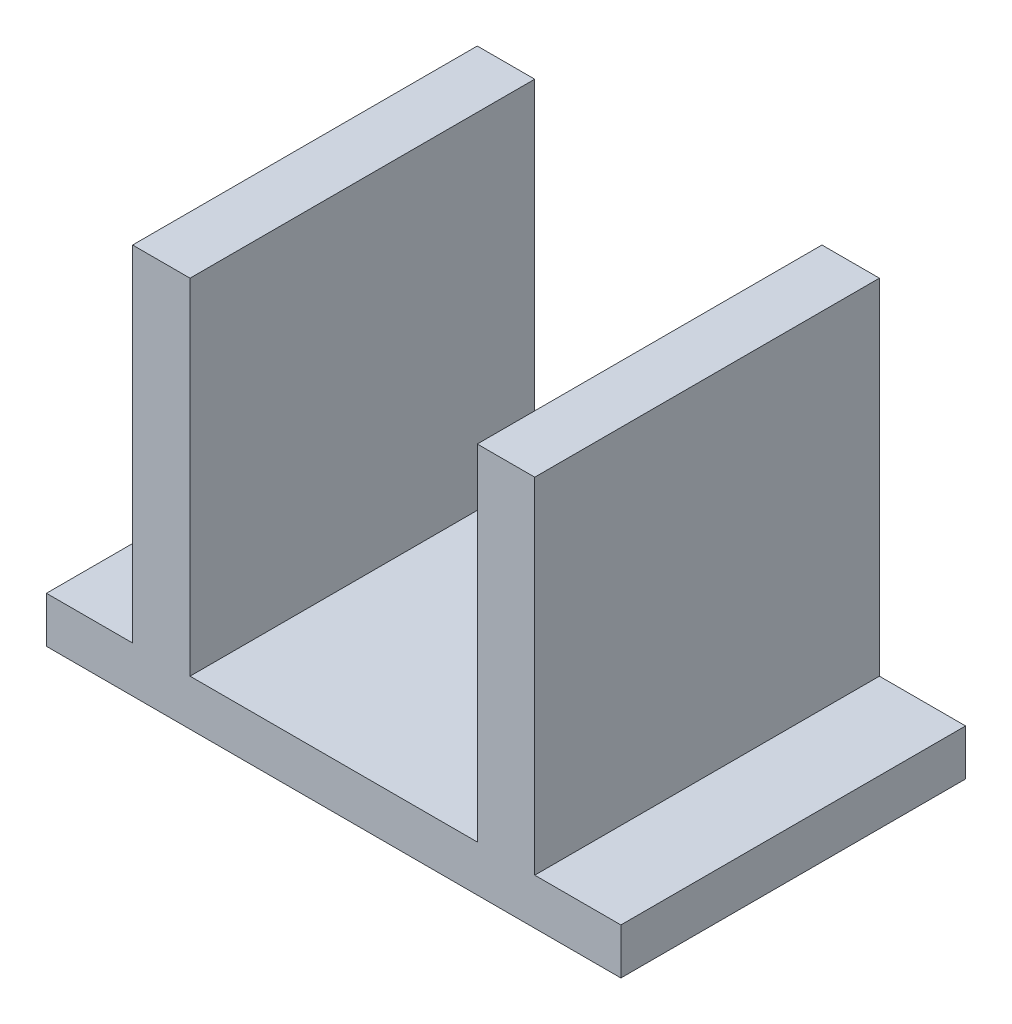
ISO-10303-21;
HEADER;
FILE_DESCRIPTION(('STEP AP214'),'2;1');
FILE_NAME('part.step','',(''),(''),'','','');
FILE_SCHEMA(('AUTOMOTIVE_DESIGN { 1 0 10303 214 1 1 1 1 }'));
ENDSEC;
DATA;
#1=APPLICATION_CONTEXT('core data for automotive mechanical design processes');
#2=APPLICATION_PROTOCOL_DEFINITION('international standard','automotive_design',2000,#1);
#3=PRODUCT_CONTEXT('',#1,'mechanical');
#4=PRODUCT('Part','Part','',(#3));
#5=PRODUCT_RELATED_PRODUCT_CATEGORY('part','',(#4));
#6=PRODUCT_DEFINITION_FORMATION('','',#4);
#7=PRODUCT_DEFINITION_CONTEXT('part definition',#1,'design');
#8=PRODUCT_DEFINITION('design','',#6,#7);
#9=PRODUCT_DEFINITION_SHAPE('','',#8);
#10=(LENGTH_UNIT() NAMED_UNIT(*) SI_UNIT(.MILLI.,.METRE.));
#11=(NAMED_UNIT(*) PLANE_ANGLE_UNIT() SI_UNIT($,.RADIAN.));
#12=(NAMED_UNIT(*) SI_UNIT($,.STERADIAN.) SOLID_ANGLE_UNIT());
#13=UNCERTAINTY_MEASURE_WITH_UNIT(LENGTH_MEASURE(1.E-05),#10,'distance_accuracy_value','');
#14=(GEOMETRIC_REPRESENTATION_CONTEXT(3) GLOBAL_UNCERTAINTY_ASSIGNED_CONTEXT((#13)) GLOBAL_UNIT_ASSIGNED_CONTEXT((#10,
#11,#12)) REPRESENTATION_CONTEXT('',''));
#15=CARTESIAN_POINT('',(0.,0.,0.));
#16=DIRECTION('',(0.,0.,1.));
#17=DIRECTION('',(1.,0.,0.));
#18=AXIS2_PLACEMENT_3D('',#15,#16,#17);
#19=CARTESIAN_POINT('',(0.,8.,0.));
#20=DIRECTION('',(0.,-1.,0.));
#21=DIRECTION('',(0.,0.,-1.));
#22=AXIS2_PLACEMENT_3D('',#19,#20,#21);
#23=PLANE('',#22);
#24=DIRECTION('',(0.,0.,-1.));
#25=VECTOR('',#24,1.);
#26=CARTESIAN_POINT('',(35.,8.,-30.));
#27=LINE('',#26,#25);
#28=CARTESIAN_POINT('',(35.,8.,30.));
#29=VERTEX_POINT('',#28);
#30=CARTESIAN_POINT('',(35.,8.,-30.));
#31=VERTEX_POINT('',#30);
#32=EDGE_CURVE('E151',#29,#31,#27,.T.);
#33=ORIENTED_EDGE('',*,*,#32,.F.);
#34=DIRECTION('',(1.,0.,0.));
#35=VECTOR('',#34,1.);
#36=CARTESIAN_POINT('',(50.,8.,30.));
#37=LINE('',#36,#35);
#38=CARTESIAN_POINT('',(50.,8.,30.));
#39=VERTEX_POINT('',#38);
#40=EDGE_CURVE('E189',#29,#39,#37,.T.);
#41=ORIENTED_EDGE('',*,*,#40,.T.);
#42=DIRECTION('',(0.,0.,-1.));
#43=VECTOR('',#42,1.);
#44=CARTESIAN_POINT('',(50.,8.,-30.));
#45=LINE('',#44,#43);
#46=CARTESIAN_POINT('',(50.,8.,-30.));
#47=VERTEX_POINT('',#46);
#48=EDGE_CURVE('E193',#39,#47,#45,.T.);
#49=ORIENTED_EDGE('',*,*,#48,.T.);
#50=DIRECTION('',(-1.,0.,0.));
#51=VECTOR('',#50,1.);
#52=CARTESIAN_POINT('',(50.,8.,-30.));
#53=LINE('',#52,#51);
#54=EDGE_CURVE('E197',#47,#31,#53,.T.);
#55=ORIENTED_EDGE('',*,*,#54,.T.);
#56=EDGE_LOOP('',(#33,#41,#49,#55));
#57=FACE_BOUND('',#56,.T.);
#58=ADVANCED_FACE('F39',(#57),#23,.F.);
#59=DIRECTION('',(0.,0.,1.));
#60=VECTOR('',#59,1.);
#61=CARTESIAN_POINT('',(25.,8.,-30.));
#62=LINE('',#61,#60);
#63=CARTESIAN_POINT('',(25.,8.,-30.));
#64=VERTEX_POINT('',#63);
#65=CARTESIAN_POINT('',(25.,8.,30.));
#66=VERTEX_POINT('',#65);
#67=EDGE_CURVE('E62',#64,#66,#62,.T.);
#68=ORIENTED_EDGE('',*,*,#67,.F.);
#69=CARTESIAN_POINT('',(-25.,8.,-30.));
#70=VERTEX_POINT('',#69);
#71=EDGE_CURVE('E199',#64,#70,#53,.T.);
#72=ORIENTED_EDGE('',*,*,#71,.T.);
#73=DIRECTION('',(0.,0.,-1.));
#74=VECTOR('',#73,1.);
#75=CARTESIAN_POINT('',(-25.,8.,-30.));
#76=LINE('',#75,#74);
#77=CARTESIAN_POINT('',(-25.,8.,30.));
#78=VERTEX_POINT('',#77);
#79=EDGE_CURVE('E174',#78,#70,#76,.T.);
#80=ORIENTED_EDGE('',*,*,#79,.F.);
#81=EDGE_CURVE('E194',#78,#66,#37,.T.);
#82=ORIENTED_EDGE('',*,*,#81,.T.);
#83=EDGE_LOOP('',(#68,#72,#80,#82));
#84=FACE_BOUND('',#83,.T.);
#85=ADVANCED_FACE('F228',(#84),#23,.F.);
#86=DIRECTION('',(0.,0.,1.));
#87=VECTOR('',#86,1.);
#88=CARTESIAN_POINT('',(-35.,8.,-30.));
#89=LINE('',#88,#87);
#90=CARTESIAN_POINT('',(-35.,8.,-30.));
#91=VERTEX_POINT('',#90);
#92=CARTESIAN_POINT('',(-35.,8.,30.));
#93=VERTEX_POINT('',#92);
#94=EDGE_CURVE('E54',#91,#93,#89,.T.);
#95=ORIENTED_EDGE('',*,*,#94,.F.);
#96=CARTESIAN_POINT('',(-50.,8.,-30.));
#97=VERTEX_POINT('',#96);
#98=EDGE_CURVE('E196',#91,#97,#53,.T.);
#99=ORIENTED_EDGE('',*,*,#98,.T.);
#100=DIRECTION('',(0.,0.,1.));
#101=VECTOR('',#100,1.);
#102=CARTESIAN_POINT('',(-50.,8.,-30.));
#103=LINE('',#102,#101);
#104=CARTESIAN_POINT('',(-50.,8.,30.));
#105=VERTEX_POINT('',#104);
#106=EDGE_CURVE('E186',#97,#105,#103,.T.);
#107=ORIENTED_EDGE('',*,*,#106,.T.);
#108=EDGE_CURVE('E191',#105,#93,#37,.T.);
#109=ORIENTED_EDGE('',*,*,#108,.T.);
#110=EDGE_LOOP('',(#95,#99,#107,#109));
#111=FACE_BOUND('',#110,.T.);
#112=ADVANCED_FACE('F226',(#111),#23,.F.);
#113=CARTESIAN_POINT('',(-50.,8.,-30.));
#114=DIRECTION('',(1.,0.,0.));
#115=DIRECTION('',(0.,0.,-1.));
#116=AXIS2_PLACEMENT_3D('',#113,#114,#115);
#117=PLANE('',#116);
#118=DIRECTION('',(0.,0.,1.));
#119=VECTOR('',#118,1.);
#120=CARTESIAN_POINT('',(-50.,0.,-30.));
#121=LINE('',#120,#119);
#122=CARTESIAN_POINT('',(-50.,0.,-30.));
#123=VERTEX_POINT('',#122);
#124=CARTESIAN_POINT('',(-50.,0.,30.));
#125=VERTEX_POINT('',#124);
#126=EDGE_CURVE('E152',#123,#125,#121,.T.);
#127=ORIENTED_EDGE('',*,*,#126,.T.);
#128=DIRECTION('',(0.,-1.,0.));
#129=VECTOR('',#128,1.);
#130=CARTESIAN_POINT('',(-50.,8.,30.));
#131=LINE('',#130,#129);
#132=EDGE_CURVE('E11',#105,#125,#131,.T.);
#133=ORIENTED_EDGE('',*,*,#132,.F.);
#134=ORIENTED_EDGE('',*,*,#106,.F.);
#135=DIRECTION('',(0.,-1.,0.));
#136=VECTOR('',#135,1.);
#137=CARTESIAN_POINT('',(-50.,8.,-30.));
#138=LINE('',#137,#136);
#139=EDGE_CURVE('E198',#97,#123,#138,.T.);
#140=ORIENTED_EDGE('',*,*,#139,.T.);
#141=EDGE_LOOP('',(#127,#133,#134,#140));
#142=FACE_BOUND('',#141,.T.);
#143=ADVANCED_FACE('F41',(#142),#117,.F.);
#144=CARTESIAN_POINT('',(50.,8.,30.));
#145=DIRECTION('',(0.,0.,-1.));
#146=DIRECTION('',(-1.,0.,0.));
#147=AXIS2_PLACEMENT_3D('',#144,#145,#146);
#148=PLANE('',#147);
#149=DIRECTION('',(1.,0.,0.));
#150=VECTOR('',#149,1.);
#151=CARTESIAN_POINT('',(50.,0.,30.));
#152=LINE('',#151,#150);
#153=CARTESIAN_POINT('',(50.,0.,30.));
#154=VERTEX_POINT('',#153);
#155=EDGE_CURVE('E155',#125,#154,#152,.T.);
#156=ORIENTED_EDGE('',*,*,#155,.T.);
#157=DIRECTION('',(0.,-1.,0.));
#158=VECTOR('',#157,1.);
#159=CARTESIAN_POINT('',(50.,8.,30.));
#160=LINE('',#159,#158);
#161=EDGE_CURVE('E47',#39,#154,#160,.T.);
#162=ORIENTED_EDGE('',*,*,#161,.F.);
#163=ORIENTED_EDGE('',*,*,#40,.F.);
#164=DIRECTION('',(0.,-1.,0.));
#165=VECTOR('',#164,1.);
#166=CARTESIAN_POINT('',(35.,68.,30.));
#167=LINE('',#166,#165);
#168=CARTESIAN_POINT('',(35.,68.,30.));
#169=VERTEX_POINT('',#168);
#170=EDGE_CURVE('E244',#169,#29,#167,.T.);
#171=ORIENTED_EDGE('',*,*,#170,.F.);
#172=DIRECTION('',(1.,0.,0.));
#173=VECTOR('',#172,1.);
#174=CARTESIAN_POINT('',(35.,68.,30.));
#175=LINE('',#174,#173);
#176=CARTESIAN_POINT('',(25.,68.,30.));
#177=VERTEX_POINT('',#176);
#178=EDGE_CURVE('E145',#177,#169,#175,.T.);
#179=ORIENTED_EDGE('',*,*,#178,.F.);
#180=DIRECTION('',(0.,-1.,0.));
#181=VECTOR('',#180,1.);
#182=CARTESIAN_POINT('',(25.,68.,30.));
#183=LINE('',#182,#181);
#184=EDGE_CURVE('E157',#177,#66,#183,.T.);
#185=ORIENTED_EDGE('',*,*,#184,.T.);
#186=ORIENTED_EDGE('',*,*,#81,.F.);
#187=DIRECTION('',(0.,-1.,0.));
#188=VECTOR('',#187,1.);
#189=CARTESIAN_POINT('',(-25.,68.,30.));
#190=LINE('',#189,#188);
#191=CARTESIAN_POINT('',(-25.,68.,30.));
#192=VERTEX_POINT('',#191);
#193=EDGE_CURVE('E164',#192,#78,#190,.T.);
#194=ORIENTED_EDGE('',*,*,#193,.F.);
#195=DIRECTION('',(1.,0.,0.));
#196=VECTOR('',#195,1.);
#197=CARTESIAN_POINT('',(-35.,68.,30.));
#198=LINE('',#197,#196);
#199=CARTESIAN_POINT('',(-35.,68.,30.));
#200=VERTEX_POINT('',#199);
#201=EDGE_CURVE('E182',#200,#192,#198,.T.);
#202=ORIENTED_EDGE('',*,*,#201,.F.);
#203=DIRECTION('',(0.,-1.,0.));
#204=VECTOR('',#203,1.);
#205=CARTESIAN_POINT('',(-35.,68.,30.));
#206=LINE('',#205,#204);
#207=EDGE_CURVE('E161',#200,#93,#206,.T.);
#208=ORIENTED_EDGE('',*,*,#207,.T.);
#209=ORIENTED_EDGE('',*,*,#108,.F.);
#210=ORIENTED_EDGE('',*,*,#132,.T.);
#211=EDGE_LOOP('',(#156,#162,#163,#171,#179,#185,#186,#194,#202,#208,#209,#210));
#212=FACE_BOUND('',#211,.T.);
#213=ADVANCED_FACE('F240',(#212),#148,.F.);
#214=CARTESIAN_POINT('',(50.,8.,-30.));
#215=DIRECTION('',(-1.,0.,0.));
#216=DIRECTION('',(0.,0.,1.));
#217=AXIS2_PLACEMENT_3D('',#214,#215,#216);
#218=PLANE('',#217);
#219=DIRECTION('',(0.,0.,-1.));
#220=VECTOR('',#219,1.);
#221=CARTESIAN_POINT('',(50.,0.,-30.));
#222=LINE('',#221,#220);
#223=CARTESIAN_POINT('',(50.,0.,-30.));
#224=VERTEX_POINT('',#223);
#225=EDGE_CURVE('E202',#154,#224,#222,.T.);
#226=ORIENTED_EDGE('',*,*,#225,.T.);
#227=DIRECTION('',(0.,-1.,0.));
#228=VECTOR('',#227,1.);
#229=CARTESIAN_POINT('',(50.,8.,-30.));
#230=LINE('',#229,#228);
#231=EDGE_CURVE('E207',#47,#224,#230,.T.);
#232=ORIENTED_EDGE('',*,*,#231,.F.);
#233=ORIENTED_EDGE('',*,*,#48,.F.);
#234=ORIENTED_EDGE('',*,*,#161,.T.);
#235=EDGE_LOOP('',(#226,#232,#233,#234));
#236=FACE_BOUND('',#235,.T.);
#237=ADVANCED_FACE('F214',(#236),#218,.F.);
#238=CARTESIAN_POINT('',(50.,8.,-30.));
#239=DIRECTION('',(0.,0.,1.));
#240=DIRECTION('',(1.,0.,0.));
#241=AXIS2_PLACEMENT_3D('',#238,#239,#240);
#242=PLANE('',#241);
#243=DIRECTION('',(-1.,0.,0.));
#244=VECTOR('',#243,1.);
#245=CARTESIAN_POINT('',(50.,0.,-30.));
#246=LINE('',#245,#244);
#247=EDGE_CURVE('E190',#224,#123,#246,.T.);
#248=ORIENTED_EDGE('',*,*,#247,.T.);
#249=ORIENTED_EDGE('',*,*,#139,.F.);
#250=ORIENTED_EDGE('',*,*,#98,.F.);
#251=DIRECTION('',(0.,-1.,0.));
#252=VECTOR('',#251,1.);
#253=CARTESIAN_POINT('',(-35.,68.,-30.));
#254=LINE('',#253,#252);
#255=CARTESIAN_POINT('',(-35.,68.,-30.));
#256=VERTEX_POINT('',#255);
#257=EDGE_CURVE('E170',#256,#91,#254,.T.);
#258=ORIENTED_EDGE('',*,*,#257,.F.);
#259=DIRECTION('',(-1.,0.,0.));
#260=VECTOR('',#259,1.);
#261=CARTESIAN_POINT('',(-35.,68.,-30.));
#262=LINE('',#261,#260);
#263=CARTESIAN_POINT('',(-25.,68.,-30.));
#264=VERTEX_POINT('',#263);
#265=EDGE_CURVE('E173',#264,#256,#262,.T.);
#266=ORIENTED_EDGE('',*,*,#265,.F.);
#267=DIRECTION('',(0.,-1.,0.));
#268=VECTOR('',#267,1.);
#269=CARTESIAN_POINT('',(-25.,68.,-30.));
#270=LINE('',#269,#268);
#271=EDGE_CURVE('E167',#264,#70,#270,.T.);
#272=ORIENTED_EDGE('',*,*,#271,.T.);
#273=ORIENTED_EDGE('',*,*,#71,.F.);
#274=DIRECTION('',(0.,-1.,0.));
#275=VECTOR('',#274,1.);
#276=CARTESIAN_POINT('',(25.,68.,-30.));
#277=LINE('',#276,#275);
#278=CARTESIAN_POINT('',(25.,68.,-30.));
#279=VERTEX_POINT('',#278);
#280=EDGE_CURVE('E136',#279,#64,#277,.T.);
#281=ORIENTED_EDGE('',*,*,#280,.F.);
#282=DIRECTION('',(-1.,0.,0.));
#283=VECTOR('',#282,1.);
#284=CARTESIAN_POINT('',(35.,68.,-30.));
#285=LINE('',#284,#283);
#286=CARTESIAN_POINT('',(35.,68.,-30.));
#287=VERTEX_POINT('',#286);
#288=EDGE_CURVE('E128',#287,#279,#285,.T.);
#289=ORIENTED_EDGE('',*,*,#288,.F.);
#290=DIRECTION('',(0.,-1.,0.));
#291=VECTOR('',#290,1.);
#292=CARTESIAN_POINT('',(35.,68.,-30.));
#293=LINE('',#292,#291);
#294=EDGE_CURVE('E133',#287,#31,#293,.T.);
#295=ORIENTED_EDGE('',*,*,#294,.T.);
#296=ORIENTED_EDGE('',*,*,#54,.F.);
#297=ORIENTED_EDGE('',*,*,#231,.T.);
#298=EDGE_LOOP('',(#248,#249,#250,#258,#266,#272,#273,#281,#289,#295,#296,#297));
#299=FACE_BOUND('',#298,.T.);
#300=ADVANCED_FACE('F130',(#299),#242,.F.);
#301=CARTESIAN_POINT('',(0.,0.,0.));
#302=DIRECTION('',(0.,-1.,0.));
#303=DIRECTION('',(0.,0.,-1.));
#304=AXIS2_PLACEMENT_3D('',#301,#302,#303);
#305=PLANE('',#304);
#306=ORIENTED_EDGE('',*,*,#126,.F.);
#307=ORIENTED_EDGE('',*,*,#247,.F.);
#308=ORIENTED_EDGE('',*,*,#225,.F.);
#309=ORIENTED_EDGE('',*,*,#155,.F.);
#310=EDGE_LOOP('',(#306,#307,#308,#309));
#311=FACE_BOUND('',#310,.T.);
#312=ADVANCED_FACE('F221',(#311),#305,.T.);
#313=CARTESIAN_POINT('',(-35.,68.,-30.));
#314=DIRECTION('',(1.,0.,0.));
#315=DIRECTION('',(0.,0.,-1.));
#316=AXIS2_PLACEMENT_3D('',#313,#314,#315);
#317=PLANE('',#316);
#318=ORIENTED_EDGE('',*,*,#94,.T.);
#319=ORIENTED_EDGE('',*,*,#207,.F.);
#320=DIRECTION('',(0.,0.,1.));
#321=VECTOR('',#320,1.);
#322=CARTESIAN_POINT('',(-35.,68.,-30.));
#323=LINE('',#322,#321);
#324=EDGE_CURVE('E177',#256,#200,#323,.T.);
#325=ORIENTED_EDGE('',*,*,#324,.F.);
#326=ORIENTED_EDGE('',*,*,#257,.T.);
#327=EDGE_LOOP('',(#318,#319,#325,#326));
#328=FACE_BOUND('',#327,.T.);
#329=ADVANCED_FACE('F281',(#328),#317,.F.);
#330=CARTESIAN_POINT('',(-25.,68.,-30.));
#331=DIRECTION('',(-1.,0.,0.));
#332=DIRECTION('',(0.,0.,1.));
#333=AXIS2_PLACEMENT_3D('',#330,#331,#332);
#334=PLANE('',#333);
#335=ORIENTED_EDGE('',*,*,#79,.T.);
#336=ORIENTED_EDGE('',*,*,#271,.F.);
#337=DIRECTION('',(0.,0.,-1.));
#338=VECTOR('',#337,1.);
#339=CARTESIAN_POINT('',(-25.,68.,-30.));
#340=LINE('',#339,#338);
#341=EDGE_CURVE('E180',#192,#264,#340,.T.);
#342=ORIENTED_EDGE('',*,*,#341,.F.);
#343=ORIENTED_EDGE('',*,*,#193,.T.);
#344=EDGE_LOOP('',(#335,#336,#342,#343));
#345=FACE_BOUND('',#344,.T.);
#346=ADVANCED_FACE('F232',(#345),#334,.F.);
#347=CARTESIAN_POINT('',(0.,68.,0.));
#348=DIRECTION('',(0.,1.,0.));
#349=DIRECTION('',(0.,0.,1.));
#350=AXIS2_PLACEMENT_3D('',#347,#348,#349);
#351=PLANE('',#350);
#352=ORIENTED_EDGE('',*,*,#324,.T.);
#353=ORIENTED_EDGE('',*,*,#201,.T.);
#354=ORIENTED_EDGE('',*,*,#341,.T.);
#355=ORIENTED_EDGE('',*,*,#265,.T.);
#356=EDGE_LOOP('',(#352,#353,#354,#355));
#357=FACE_BOUND('',#356,.T.);
#358=ADVANCED_FACE('F238',(#357),#351,.T.);
#359=CARTESIAN_POINT('',(35.,68.,-30.));
#360=DIRECTION('',(-1.,0.,0.));
#361=DIRECTION('',(0.,0.,1.));
#362=AXIS2_PLACEMENT_3D('',#359,#360,#361);
#363=PLANE('',#362);
#364=ORIENTED_EDGE('',*,*,#32,.T.);
#365=ORIENTED_EDGE('',*,*,#294,.F.);
#366=DIRECTION('',(0.,0.,-1.));
#367=VECTOR('',#366,1.);
#368=CARTESIAN_POINT('',(35.,68.,-30.));
#369=LINE('',#368,#367);
#370=EDGE_CURVE('E140',#169,#287,#369,.T.);
#371=ORIENTED_EDGE('',*,*,#370,.F.);
#372=ORIENTED_EDGE('',*,*,#170,.T.);
#373=EDGE_LOOP('',(#364,#365,#371,#372));
#374=FACE_BOUND('',#373,.T.);
#375=ADVANCED_FACE('F150',(#374),#363,.F.);
#376=CARTESIAN_POINT('',(25.,68.,-30.));
#377=DIRECTION('',(1.,0.,0.));
#378=DIRECTION('',(0.,0.,-1.));
#379=AXIS2_PLACEMENT_3D('',#376,#377,#378);
#380=PLANE('',#379);
#381=ORIENTED_EDGE('',*,*,#67,.T.);
#382=ORIENTED_EDGE('',*,*,#184,.F.);
#383=DIRECTION('',(0.,0.,1.));
#384=VECTOR('',#383,1.);
#385=CARTESIAN_POINT('',(25.,68.,-30.));
#386=LINE('',#385,#384);
#387=EDGE_CURVE('E139',#279,#177,#386,.T.);
#388=ORIENTED_EDGE('',*,*,#387,.F.);
#389=ORIENTED_EDGE('',*,*,#280,.T.);
#390=EDGE_LOOP('',(#381,#382,#388,#389));
#391=FACE_BOUND('',#390,.T.);
#392=ADVANCED_FACE('F251',(#391),#380,.F.);
#393=CARTESIAN_POINT('',(0.,68.,0.));
#394=DIRECTION('',(0.,-1.,0.));
#395=DIRECTION('',(0.,0.,-1.));
#396=AXIS2_PLACEMENT_3D('',#393,#394,#395);
#397=PLANE('',#396);
#398=ORIENTED_EDGE('',*,*,#370,.T.);
#399=ORIENTED_EDGE('',*,*,#288,.T.);
#400=ORIENTED_EDGE('',*,*,#387,.T.);
#401=ORIENTED_EDGE('',*,*,#178,.T.);
#402=EDGE_LOOP('',(#398,#399,#400,#401));
#403=FACE_BOUND('',#402,.T.);
#404=ADVANCED_FACE('F143',(#403),#397,.F.);
#405=CLOSED_SHELL('',(#58,#85,#112,#143,#213,#237,#300,#312,#329,#346,#358,#375,#392,#404));
#406=MANIFOLD_SOLID_BREP('B2',#405);
#407=ADVANCED_BREP_SHAPE_REPRESENTATION('',(#18,#406),#14);
#408=SHAPE_DEFINITION_REPRESENTATION(#9,#407);
ENDSEC;
END-ISO-10303-21;
